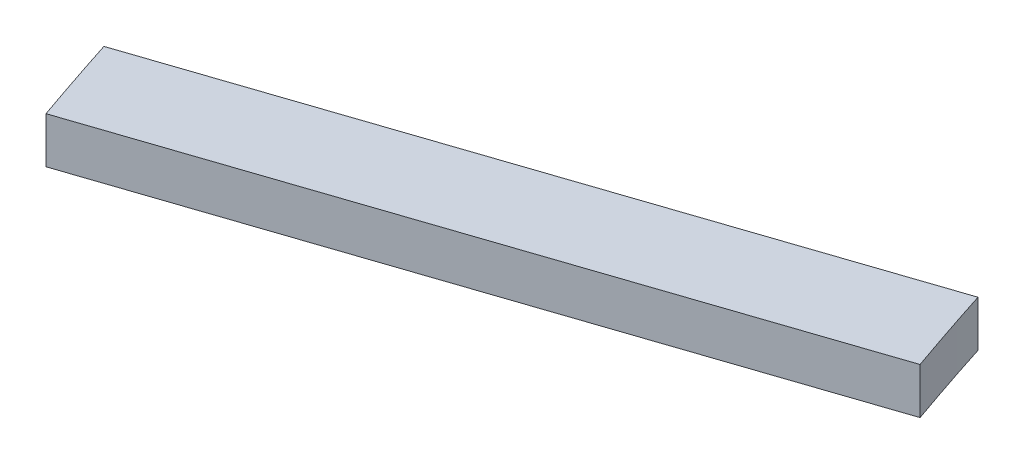
ISO-10303-21;
HEADER;
FILE_DESCRIPTION(('STEP AP214'),'2;1');
FILE_NAME('part.step','',(''),(''),'','','');
FILE_SCHEMA(('AUTOMOTIVE_DESIGN { 1 0 10303 214 1 1 1 1 }'));
ENDSEC;
DATA;
#1=APPLICATION_CONTEXT('core data for automotive mechanical design processes');
#2=APPLICATION_PROTOCOL_DEFINITION('international standard','automotive_design',2000,#1);
#3=PRODUCT_CONTEXT('',#1,'mechanical');
#4=PRODUCT('Part','Part','',(#3));
#5=PRODUCT_RELATED_PRODUCT_CATEGORY('part','',(#4));
#6=PRODUCT_DEFINITION_FORMATION('','',#4);
#7=PRODUCT_DEFINITION_CONTEXT('part definition',#1,'design');
#8=PRODUCT_DEFINITION('design','',#6,#7);
#9=PRODUCT_DEFINITION_SHAPE('','',#8);
#10=(LENGTH_UNIT() NAMED_UNIT(*) SI_UNIT(.MILLI.,.METRE.));
#11=(NAMED_UNIT(*) PLANE_ANGLE_UNIT() SI_UNIT($,.RADIAN.));
#12=(NAMED_UNIT(*) SI_UNIT($,.STERADIAN.) SOLID_ANGLE_UNIT());
#13=UNCERTAINTY_MEASURE_WITH_UNIT(LENGTH_MEASURE(1.E-05),#10,'distance_accuracy_value','');
#14=(GEOMETRIC_REPRESENTATION_CONTEXT(3) GLOBAL_UNCERTAINTY_ASSIGNED_CONTEXT((#13)) GLOBAL_UNIT_ASSIGNED_CONTEXT((#10,
#11,#12)) REPRESENTATION_CONTEXT('',''));
#15=CARTESIAN_POINT('',(0.,0.,0.));
#16=DIRECTION('',(0.,0.,1.));
#17=DIRECTION('',(1.,0.,0.));
#18=AXIS2_PLACEMENT_3D('',#15,#16,#17);
#19=CARTESIAN_POINT('',(-6.32402849270683E-13,7.62,-2.95536896665494E-13));
#20=DIRECTION('',(0.,1.,0.));
#21=DIRECTION('',(0.,0.,1.));
#22=AXIS2_PLACEMENT_3D('',#19,#20,#21);
#23=PLANE('',#22);
#24=DIRECTION('',(0.947927346167132,0.,-0.318486650251683));
#25=VECTOR('',#24,1.);
#26=CARTESIAN_POINT('',(-17.1390722815908,7.62,5.49046901160678));
#27=LINE('',#26,#25);
#28=CARTESIAN_POINT('',(-20.7509723596619,7.62,6.7040028985233));
#29=VERTEX_POINT('',#28);
#30=CARTESIAN_POINT('',(-17.1390722815908,7.62,5.49046901160678));
#31=VERTEX_POINT('',#30);
#32=EDGE_CURVE('E59',#29,#31,#27,.T.);
#33=ORIENTED_EDGE('',*,*,#32,.T.);
#34=CARTESIAN_POINT('',(-6.32402849270683E-13,7.62,-2.95536896665494E-13));
#35=DIRECTION('',(0.,1.,0.));
#36=DIRECTION('',(0.,0.,1.));
#37=AXIS2_PLACEMENT_3D('',#34,#35,#36);
#38=CIRCLE('',#37,17.9970288837072);
#39=CARTESIAN_POINT('',(-16.977281063263,7.62,5.9720161034597));
#40=VERTEX_POINT('',#39);
#41=EDGE_CURVE('E81',#31,#40,#38,.T.);
#42=ORIENTED_EDGE('',*,*,#41,.T.);
#43=DIRECTION('',(-0.947927346167133,0.,0.318486650251682));
#44=VECTOR('',#43,1.);
#45=CARTESIAN_POINT('',(-16.9772810632629,7.62,5.97201610345969));
#46=LINE('',#45,#44);
#47=CARTESIAN_POINT('',(-20.589181141334,7.62,7.18554999037621));
#48=VERTEX_POINT('',#47);
#49=EDGE_CURVE('E60',#40,#48,#46,.T.);
#50=ORIENTED_EDGE('',*,*,#49,.T.);
#51=CARTESIAN_POINT('',(-6.32402849270683E-13,7.62,-2.95536896665494E-13));
#52=DIRECTION('',(0.,1.,0.));
#53=DIRECTION('',(0.,0.,1.));
#54=AXIS2_PLACEMENT_3D('',#51,#52,#53);
#55=CIRCLE('',#54,21.8070288837072);
#56=EDGE_CURVE('E20',#29,#48,#55,.T.);
#57=ORIENTED_EDGE('',*,*,#56,.F.);
#58=EDGE_LOOP('',(#33,#42,#50,#57));
#59=FACE_BOUND('',#58,.T.);
#60=ADVANCED_FACE('F17',(#59),#23,.F.);
#61=CARTESIAN_POINT('',(-6.32402849270683E-13,7.874,-2.95536896665494E-13));
#62=DIRECTION('',(0.,1.,0.));
#63=DIRECTION('',(0.,0.,1.));
#64=AXIS2_PLACEMENT_3D('',#61,#62,#63);
#65=CYLINDRICAL_SURFACE('',#64,21.8070288837072);
#66=CARTESIAN_POINT('',(-6.32402849270683E-13,7.874,-2.95536896665494E-13));
#67=DIRECTION('',(0.,1.,0.));
#68=DIRECTION('',(0.,0.,1.));
#69=AXIS2_PLACEMENT_3D('',#66,#67,#68);
#70=CIRCLE('',#69,21.8070288837072);
#71=CARTESIAN_POINT('',(-20.7509723596619,7.874,6.7040028985233));
#72=VERTEX_POINT('',#71);
#73=CARTESIAN_POINT('',(-20.589181141334,7.874,7.18554999037621));
#74=VERTEX_POINT('',#73);
#75=EDGE_CURVE('E68',#72,#74,#70,.T.);
#76=ORIENTED_EDGE('',*,*,#75,.F.);
#77=DIRECTION('',(0.,1.,0.));
#78=VECTOR('',#77,1.);
#79=CARTESIAN_POINT('',(-20.7509723596619,7.874,6.7040028985233));
#80=LINE('',#79,#78);
#81=EDGE_CURVE('E65',#72,#29,#80,.F.);
#82=ORIENTED_EDGE('',*,*,#81,.T.);
#83=ORIENTED_EDGE('',*,*,#56,.T.);
#84=DIRECTION('',(0.,1.,0.));
#85=VECTOR('',#84,1.);
#86=CARTESIAN_POINT('',(-20.589181141334,7.874,7.1855499903762));
#87=LINE('',#86,#85);
#88=EDGE_CURVE('E63',#48,#74,#87,.T.);
#89=ORIENTED_EDGE('',*,*,#88,.T.);
#90=EDGE_LOOP('',(#76,#82,#83,#89));
#91=FACE_BOUND('',#90,.T.);
#92=ADVANCED_FACE('F66',(#91),#65,.T.);
#93=CARTESIAN_POINT('',(-16.9772810632629,7.874,5.97201610345969));
#94=DIRECTION('',(-0.318486650251682,0.,-0.947927346167133));
#95=DIRECTION('',(-0.947927346167133,0.,0.318486650251682));
#96=AXIS2_PLACEMENT_3D('',#93,#94,#95);
#97=PLANE('',#96);
#98=DIRECTION('',(0.,1.,0.));
#99=VECTOR('',#98,1.);
#100=CARTESIAN_POINT('',(-16.977281063263,7.874,5.9720161034597));
#101=LINE('',#100,#99);
#102=CARTESIAN_POINT('',(-16.977281063263,7.874,5.9720161034597));
#103=VERTEX_POINT('',#102);
#104=EDGE_CURVE('E79',#40,#103,#101,.T.);
#105=ORIENTED_EDGE('',*,*,#104,.T.);
#106=DIRECTION('',(0.947927346167132,0.,-0.318486650251682));
#107=VECTOR('',#106,1.);
#108=CARTESIAN_POINT('',(-20.589181141334,7.874,7.1855499903762));
#109=LINE('',#108,#107);
#110=EDGE_CURVE('E73',#74,#103,#109,.T.);
#111=ORIENTED_EDGE('',*,*,#110,.F.);
#112=ORIENTED_EDGE('',*,*,#88,.F.);
#113=ORIENTED_EDGE('',*,*,#49,.F.);
#114=EDGE_LOOP('',(#105,#111,#112,#113));
#115=FACE_BOUND('',#114,.T.);
#116=ADVANCED_FACE('F90',(#115),#97,.F.);
#117=CARTESIAN_POINT('',(-6.32402849270683E-13,7.874,-2.95536896665494E-13));
#118=DIRECTION('',(0.,1.,0.));
#119=DIRECTION('',(0.,0.,1.));
#120=AXIS2_PLACEMENT_3D('',#117,#118,#119);
#121=CYLINDRICAL_SURFACE('',#120,17.9970288837072);
#122=DIRECTION('',(0.,1.,0.));
#123=VECTOR('',#122,1.);
#124=CARTESIAN_POINT('',(-17.1390722815908,7.874,5.49046901160678));
#125=LINE('',#124,#123);
#126=CARTESIAN_POINT('',(-17.1390722815908,7.874,5.49046901160679));
#127=VERTEX_POINT('',#126);
#128=EDGE_CURVE('E35',#31,#127,#125,.T.);
#129=ORIENTED_EDGE('',*,*,#128,.T.);
#130=CARTESIAN_POINT('',(-6.32402849270683E-13,7.874,-2.95536896665494E-13));
#131=DIRECTION('',(0.,1.,0.));
#132=DIRECTION('',(0.,0.,1.));
#133=AXIS2_PLACEMENT_3D('',#130,#131,#132);
#134=CIRCLE('',#133,17.9970288837072);
#135=EDGE_CURVE('E26',#103,#127,#134,.F.);
#136=ORIENTED_EDGE('',*,*,#135,.F.);
#137=ORIENTED_EDGE('',*,*,#104,.F.);
#138=ORIENTED_EDGE('',*,*,#41,.F.);
#139=EDGE_LOOP('',(#129,#136,#137,#138));
#140=FACE_BOUND('',#139,.T.);
#141=ADVANCED_FACE('F92',(#140),#121,.F.);
#142=CARTESIAN_POINT('',(-17.1390722815908,7.874,5.49046901160678));
#143=DIRECTION('',(0.318486650251683,0.,0.947927346167132));
#144=DIRECTION('',(0.947927346167132,0.,-0.318486650251683));
#145=AXIS2_PLACEMENT_3D('',#142,#143,#144);
#146=PLANE('',#145);
#147=ORIENTED_EDGE('',*,*,#81,.F.);
#148=DIRECTION('',(-0.947927346167133,0.,0.318486650251682));
#149=VECTOR('',#148,1.);
#150=CARTESIAN_POINT('',(-17.1390722815908,7.874,5.49046901160679));
#151=LINE('',#150,#149);
#152=EDGE_CURVE('E11',#127,#72,#151,.T.);
#153=ORIENTED_EDGE('',*,*,#152,.F.);
#154=ORIENTED_EDGE('',*,*,#128,.F.);
#155=ORIENTED_EDGE('',*,*,#32,.F.);
#156=EDGE_LOOP('',(#147,#153,#154,#155));
#157=FACE_BOUND('',#156,.T.);
#158=ADVANCED_FACE('F71',(#157),#146,.F.);
#159=CARTESIAN_POINT('',(-6.32402849270683E-13,7.874,-2.95536896665494E-13));
#160=DIRECTION('',(0.,1.,0.));
#161=DIRECTION('',(0.,0.,1.));
#162=AXIS2_PLACEMENT_3D('',#159,#160,#161);
#163=PLANE('',#162);
#164=ORIENTED_EDGE('',*,*,#135,.T.);
#165=ORIENTED_EDGE('',*,*,#152,.T.);
#166=ORIENTED_EDGE('',*,*,#75,.T.);
#167=ORIENTED_EDGE('',*,*,#110,.T.);
#168=EDGE_LOOP('',(#164,#165,#166,#167));
#169=FACE_BOUND('',#168,.T.);
#170=ADVANCED_FACE('F89',(#169),#163,.T.);
#171=CLOSED_SHELL('',(#60,#92,#116,#141,#158,#170));
#172=MANIFOLD_SOLID_BREP('B1',#171);
#173=ADVANCED_BREP_SHAPE_REPRESENTATION('',(#18,#172),#14);
#174=SHAPE_DEFINITION_REPRESENTATION(#9,#173);
ENDSEC;
END-ISO-10303-21;
